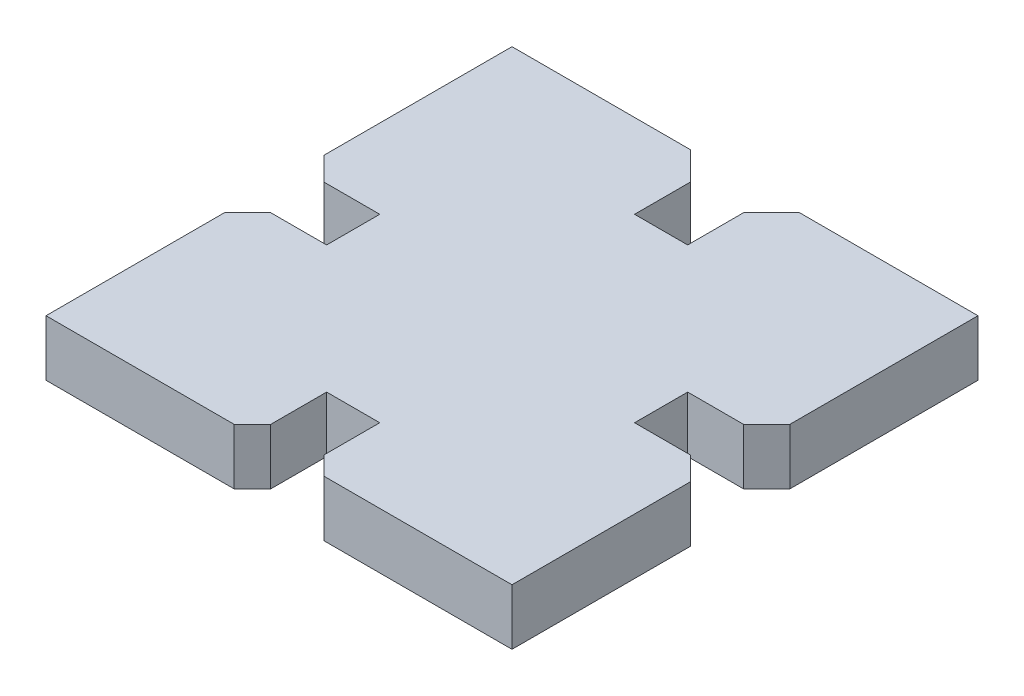
ISO-10303-21;
HEADER;
FILE_DESCRIPTION(('STEP AP214'),'2;1');
FILE_NAME('part.step','',(''),(''),'','','');
FILE_SCHEMA(('AUTOMOTIVE_DESIGN { 1 0 10303 214 1 1 1 1 }'));
ENDSEC;
DATA;
#1=APPLICATION_CONTEXT('core data for automotive mechanical design processes');
#2=APPLICATION_PROTOCOL_DEFINITION('international standard','automotive_design',2000,#1);
#3=PRODUCT_CONTEXT('',#1,'mechanical');
#4=PRODUCT('Part','Part','',(#3));
#5=PRODUCT_RELATED_PRODUCT_CATEGORY('part','',(#4));
#6=PRODUCT_DEFINITION_FORMATION('','',#4);
#7=PRODUCT_DEFINITION_CONTEXT('part definition',#1,'design');
#8=PRODUCT_DEFINITION('design','',#6,#7);
#9=PRODUCT_DEFINITION_SHAPE('','',#8);
#10=(LENGTH_UNIT() NAMED_UNIT(*) SI_UNIT(.MILLI.,.METRE.));
#11=(NAMED_UNIT(*) PLANE_ANGLE_UNIT() SI_UNIT($,.RADIAN.));
#12=(NAMED_UNIT(*) SI_UNIT($,.STERADIAN.) SOLID_ANGLE_UNIT());
#13=UNCERTAINTY_MEASURE_WITH_UNIT(LENGTH_MEASURE(1.E-05),#10,'distance_accuracy_value','');
#14=(GEOMETRIC_REPRESENTATION_CONTEXT(3) GLOBAL_UNCERTAINTY_ASSIGNED_CONTEXT((#13)) GLOBAL_UNIT_ASSIGNED_CONTEXT((#10,
#11,#12)) REPRESENTATION_CONTEXT('',''));
#15=CARTESIAN_POINT('',(0.,0.,0.));
#16=DIRECTION('',(0.,0.,1.));
#17=DIRECTION('',(1.,0.,0.));
#18=AXIS2_PLACEMENT_3D('',#15,#16,#17);
#19=CARTESIAN_POINT('',(0.,6.,0.));
#20=DIRECTION('',(1.,0.,0.));
#21=DIRECTION('',(0.,0.,-1.));
#22=AXIS2_PLACEMENT_3D('',#19,#20,#21);
#23=PLANE('',#22);
#24=DIRECTION('',(0.,-1.,0.));
#25=VECTOR('',#24,1.);
#26=CARTESIAN_POINT('',(0.,6.,-19.1499999999999));
#27=LINE('',#26,#25);
#28=CARTESIAN_POINT('',(0.,0.,-19.1499999999999));
#29=VERTEX_POINT('',#28);
#30=CARTESIAN_POINT('',(0.,6.,-19.1499999999999));
#31=VERTEX_POINT('',#30);
#32=EDGE_CURVE('E343',#29,#31,#27,.F.);
#33=ORIENTED_EDGE('',*,*,#32,.F.);
#34=DIRECTION('',(0.,0.,1.));
#35=VECTOR('',#34,1.);
#36=CARTESIAN_POINT('',(0.,0.,0.));
#37=LINE('',#36,#35);
#38=CARTESIAN_POINT('',(0.,0.,0.));
#39=VERTEX_POINT('',#38);
#40=EDGE_CURVE('E364',#29,#39,#37,.T.);
#41=ORIENTED_EDGE('',*,*,#40,.T.);
#42=DIRECTION('',(0.,-1.,0.));
#43=VECTOR('',#42,1.);
#44=CARTESIAN_POINT('',(0.,6.,0.));
#45=LINE('',#44,#43);
#46=CARTESIAN_POINT('',(0.,6.,0.));
#47=VERTEX_POINT('',#46);
#48=EDGE_CURVE('E406',#47,#39,#45,.T.);
#49=ORIENTED_EDGE('',*,*,#48,.F.);
#50=DIRECTION('',(0.,0.,1.));
#51=VECTOR('',#50,1.);
#52=CARTESIAN_POINT('',(0.,6.,0.));
#53=LINE('',#52,#51);
#54=EDGE_CURVE('E371',#31,#47,#53,.T.);
#55=ORIENTED_EDGE('',*,*,#54,.F.);
#56=EDGE_LOOP('',(#33,#41,#49,#55));
#57=FACE_BOUND('',#56,.T.);
#58=ADVANCED_FACE('F35',(#57),#23,.F.);
#59=DIRECTION('',(0.,1.,0.));
#60=VECTOR('',#59,1.);
#61=CARTESIAN_POINT('',(0.,6.,-29.8108148542853));
#62=LINE('',#61,#60);
#63=CARTESIAN_POINT('',(0.,6.,-29.8108148542853));
#64=VERTEX_POINT('',#63);
#65=CARTESIAN_POINT('',(0.,0.,-29.8108148542853));
#66=VERTEX_POINT('',#65);
#67=EDGE_CURVE('E51',#64,#66,#62,.F.);
#68=ORIENTED_EDGE('',*,*,#67,.F.);
#69=CARTESIAN_POINT('',(0.,6.,-50.));
#70=VERTEX_POINT('',#69);
#71=EDGE_CURVE('E367',#70,#64,#53,.T.);
#72=ORIENTED_EDGE('',*,*,#71,.F.);
#73=DIRECTION('',(0.,-1.,0.));
#74=VECTOR('',#73,1.);
#75=CARTESIAN_POINT('',(0.,6.,-50.));
#76=LINE('',#75,#74);
#77=CARTESIAN_POINT('',(0.,0.,-50.));
#78=VERTEX_POINT('',#77);
#79=EDGE_CURVE('E383',#70,#78,#76,.T.);
#80=ORIENTED_EDGE('',*,*,#79,.T.);
#81=EDGE_CURVE('E384',#78,#66,#37,.T.);
#82=ORIENTED_EDGE('',*,*,#81,.T.);
#83=EDGE_LOOP('',(#68,#72,#80,#82));
#84=FACE_BOUND('',#83,.T.);
#85=ADVANCED_FACE('F477',(#84),#23,.F.);
#86=CARTESIAN_POINT('',(0.,6.,0.));
#87=DIRECTION('',(0.,0.,-1.));
#88=DIRECTION('',(-1.,0.,0.));
#89=AXIS2_PLACEMENT_3D('',#86,#87,#88);
#90=PLANE('',#89);
#91=DIRECTION('',(0.,-1.,0.));
#92=VECTOR('',#91,1.);
#93=CARTESIAN_POINT('',(29.8108148542854,6.,0.));
#94=LINE('',#93,#92);
#95=CARTESIAN_POINT('',(29.8108148542854,0.,0.));
#96=VERTEX_POINT('',#95);
#97=CARTESIAN_POINT('',(29.8108148542854,6.,0.));
#98=VERTEX_POINT('',#97);
#99=EDGE_CURVE('E340',#96,#98,#94,.F.);
#100=ORIENTED_EDGE('',*,*,#99,.F.);
#101=DIRECTION('',(1.,0.,0.));
#102=VECTOR('',#101,1.);
#103=CARTESIAN_POINT('',(0.,0.,0.));
#104=LINE('',#103,#102);
#105=CARTESIAN_POINT('',(50.,0.,0.));
#106=VERTEX_POINT('',#105);
#107=EDGE_CURVE('E386',#96,#106,#104,.T.);
#108=ORIENTED_EDGE('',*,*,#107,.T.);
#109=DIRECTION('',(0.,-1.,0.));
#110=VECTOR('',#109,1.);
#111=CARTESIAN_POINT('',(50.,6.,0.));
#112=LINE('',#111,#110);
#113=CARTESIAN_POINT('',(50.,6.,0.));
#114=VERTEX_POINT('',#113);
#115=EDGE_CURVE('E403',#114,#106,#112,.T.);
#116=ORIENTED_EDGE('',*,*,#115,.F.);
#117=DIRECTION('',(1.,0.,0.));
#118=VECTOR('',#117,1.);
#119=CARTESIAN_POINT('',(0.,6.,0.));
#120=LINE('',#119,#118);
#121=EDGE_CURVE('E370',#98,#114,#120,.T.);
#122=ORIENTED_EDGE('',*,*,#121,.F.);
#123=EDGE_LOOP('',(#100,#108,#116,#122));
#124=FACE_BOUND('',#123,.T.);
#125=ADVANCED_FACE('F439',(#124),#90,.F.);
#126=DIRECTION('',(0.,1.,0.));
#127=VECTOR('',#126,1.);
#128=CARTESIAN_POINT('',(20.1891851457146,6.,0.));
#129=LINE('',#128,#127);
#130=CARTESIAN_POINT('',(20.1891851457146,6.,0.));
#131=VERTEX_POINT('',#130);
#132=CARTESIAN_POINT('',(20.1891851457146,0.,0.));
#133=VERTEX_POINT('',#132);
#134=EDGE_CURVE('E59',#131,#133,#129,.F.);
#135=ORIENTED_EDGE('',*,*,#134,.F.);
#136=EDGE_CURVE('E372',#47,#131,#120,.T.);
#137=ORIENTED_EDGE('',*,*,#136,.F.);
#138=ORIENTED_EDGE('',*,*,#48,.T.);
#139=EDGE_CURVE('E387',#39,#133,#104,.T.);
#140=ORIENTED_EDGE('',*,*,#139,.T.);
#141=EDGE_LOOP('',(#135,#137,#138,#140));
#142=FACE_BOUND('',#141,.T.);
#143=ADVANCED_FACE('F459',(#142),#90,.F.);
#144=CARTESIAN_POINT('',(50.,6.,0.));
#145=DIRECTION('',(-1.,0.,0.));
#146=DIRECTION('',(0.,0.,1.));
#147=AXIS2_PLACEMENT_3D('',#144,#145,#146);
#148=PLANE('',#147);
#149=DIRECTION('',(0.,-1.,0.));
#150=VECTOR('',#149,1.);
#151=CARTESIAN_POINT('',(50.,6.,-29.8108148542857));
#152=LINE('',#151,#150);
#153=CARTESIAN_POINT('',(50.,0.,-29.8108148542857));
#154=VERTEX_POINT('',#153);
#155=CARTESIAN_POINT('',(50.,6.,-29.8108148542857));
#156=VERTEX_POINT('',#155);
#157=EDGE_CURVE('E337',#154,#156,#152,.F.);
#158=ORIENTED_EDGE('',*,*,#157,.F.);
#159=DIRECTION('',(0.,0.,-1.));
#160=VECTOR('',#159,1.);
#161=CARTESIAN_POINT('',(50.,0.,0.));
#162=LINE('',#161,#160);
#163=CARTESIAN_POINT('',(50.,0.,-50.));
#164=VERTEX_POINT('',#163);
#165=EDGE_CURVE('E390',#154,#164,#162,.T.);
#166=ORIENTED_EDGE('',*,*,#165,.T.);
#167=DIRECTION('',(0.,-1.,0.));
#168=VECTOR('',#167,1.);
#169=CARTESIAN_POINT('',(50.,6.,-50.));
#170=LINE('',#169,#168);
#171=CARTESIAN_POINT('',(50.,6.,-50.));
#172=VERTEX_POINT('',#171);
#173=EDGE_CURVE('E400',#172,#164,#170,.T.);
#174=ORIENTED_EDGE('',*,*,#173,.F.);
#175=DIRECTION('',(0.,0.,-1.));
#176=VECTOR('',#175,1.);
#177=CARTESIAN_POINT('',(50.,6.,0.));
#178=LINE('',#177,#176);
#179=EDGE_CURVE('E375',#156,#172,#178,.T.);
#180=ORIENTED_EDGE('',*,*,#179,.F.);
#181=EDGE_LOOP('',(#158,#166,#174,#180));
#182=FACE_BOUND('',#181,.T.);
#183=ADVANCED_FACE('F513',(#182),#148,.F.);
#184=DIRECTION('',(0.,1.,0.));
#185=VECTOR('',#184,1.);
#186=CARTESIAN_POINT('',(50.,6.,-19.1500000000003));
#187=LINE('',#186,#185);
#188=CARTESIAN_POINT('',(50.,6.,-19.1500000000003));
#189=VERTEX_POINT('',#188);
#190=CARTESIAN_POINT('',(50.,0.,-19.1500000000003));
#191=VERTEX_POINT('',#190);
#192=EDGE_CURVE('E265',#189,#191,#187,.F.);
#193=ORIENTED_EDGE('',*,*,#192,.F.);
#194=EDGE_CURVE('E376',#114,#189,#178,.T.);
#195=ORIENTED_EDGE('',*,*,#194,.F.);
#196=ORIENTED_EDGE('',*,*,#115,.T.);
#197=EDGE_CURVE('E391',#106,#191,#162,.T.);
#198=ORIENTED_EDGE('',*,*,#197,.T.);
#199=EDGE_LOOP('',(#193,#195,#196,#198));
#200=FACE_BOUND('',#199,.T.);
#201=ADVANCED_FACE('F532',(#200),#148,.F.);
#202=CARTESIAN_POINT('',(0.,6.,0.));
#203=DIRECTION('',(0.,-1.,0.));
#204=DIRECTION('',(0.,0.,-1.));
#205=AXIS2_PLACEMENT_3D('',#202,#203,#204);
#206=PLANE('',#205);
#207=DIRECTION('',(0.707106781186542,0.,-0.707106781186553));
#208=VECTOR('',#207,1.);
#209=CARTESIAN_POINT('',(2.48040742714267,6.,-21.6304074271426));
#210=LINE('',#209,#208);
#211=CARTESIAN_POINT('',(2.48040742714267,6.,-21.6304074271426));
#212=VERTEX_POINT('',#211);
#213=EDGE_CURVE('E262',#212,#31,#210,.F.);
#214=ORIENTED_EDGE('',*,*,#213,.T.);
#215=ORIENTED_EDGE('',*,*,#54,.T.);
#216=ORIENTED_EDGE('',*,*,#136,.T.);
#217=DIRECTION('',(-0.707106781186547,0.,0.707106781186548));
#218=VECTOR('',#217,1.);
#219=CARTESIAN_POINT('',(19.15,6.,1.03918514571464));
#220=LINE('',#219,#218);
#221=CARTESIAN_POINT('',(22.15,6.,-1.96081485428538));
#222=VERTEX_POINT('',#221);
#223=EDGE_CURVE('E272',#131,#222,#220,.F.);
#224=ORIENTED_EDGE('',*,*,#223,.T.);
#225=DIRECTION('',(0.,0.,1.));
#226=VECTOR('',#225,1.);
#227=CARTESIAN_POINT('',(22.15,6.,1.03918514571464));
#228=LINE('',#227,#226);
#229=CARTESIAN_POINT('',(22.15,6.,-7.96081485428536));
#230=VERTEX_POINT('',#229);
#231=EDGE_CURVE('E275',#230,#222,#228,.T.);
#232=ORIENTED_EDGE('',*,*,#231,.F.);
#233=DIRECTION('',(-1.,0.,0.));
#234=VECTOR('',#233,1.);
#235=CARTESIAN_POINT('',(27.85,6.,-7.96081485428536));
#236=LINE('',#235,#234);
#237=CARTESIAN_POINT('',(27.85,6.,-7.96081485428536));
#238=VERTEX_POINT('',#237);
#239=EDGE_CURVE('E283',#238,#230,#236,.T.);
#240=ORIENTED_EDGE('',*,*,#239,.F.);
#241=DIRECTION('',(0.,0.,-1.));
#242=VECTOR('',#241,1.);
#243=CARTESIAN_POINT('',(27.85,6.,1.03918514571464));
#244=LINE('',#243,#242);
#245=CARTESIAN_POINT('',(27.85,6.,-1.96081485428534));
#246=VERTEX_POINT('',#245);
#247=EDGE_CURVE('E296',#246,#238,#244,.T.);
#248=ORIENTED_EDGE('',*,*,#247,.F.);
#249=DIRECTION('',(-0.707106781186551,0.,-0.707106781186544));
#250=VECTOR('',#249,1.);
#251=CARTESIAN_POINT('',(27.85,6.,-1.96081485428534));
#252=LINE('',#251,#250);
#253=EDGE_CURVE('E227',#246,#98,#252,.F.);
#254=ORIENTED_EDGE('',*,*,#253,.T.);
#255=ORIENTED_EDGE('',*,*,#121,.T.);
#256=ORIENTED_EDGE('',*,*,#194,.T.);
#257=DIRECTION('',(0.707106781186556,0.,0.707106781186539));
#258=VECTOR('',#257,1.);
#259=CARTESIAN_POINT('',(50.5195925728574,6.,-18.6304074271429));
#260=LINE('',#259,#258);
#261=CARTESIAN_POINT('',(47.5195925728573,6.,-21.6304074271429));
#262=VERTEX_POINT('',#261);
#263=EDGE_CURVE('E307',#189,#262,#260,.F.);
#264=ORIENTED_EDGE('',*,*,#263,.T.);
#265=DIRECTION('',(1.,0.,0.));
#266=VECTOR('',#265,1.);
#267=CARTESIAN_POINT('',(50.5195925728574,6.,-21.630407427143));
#268=LINE('',#267,#266);
#269=CARTESIAN_POINT('',(41.5195925728574,6.,-21.6304074271429));
#270=VERTEX_POINT('',#269);
#271=EDGE_CURVE('E310',#270,#262,#268,.T.);
#272=ORIENTED_EDGE('',*,*,#271,.F.);
#273=DIRECTION('',(0.,0.,1.));
#274=VECTOR('',#273,1.);
#275=CARTESIAN_POINT('',(41.5195925728573,6.,-27.3304074271429));
#276=LINE('',#275,#274);
#277=CARTESIAN_POINT('',(41.5195925728573,6.,-27.3304074271429));
#278=VERTEX_POINT('',#277);
#279=EDGE_CURVE('E318',#278,#270,#276,.T.);
#280=ORIENTED_EDGE('',*,*,#279,.F.);
#281=DIRECTION('',(-1.,0.,0.));
#282=VECTOR('',#281,1.);
#283=CARTESIAN_POINT('',(50.5195925728573,6.,-27.330407427143));
#284=LINE('',#283,#282);
#285=CARTESIAN_POINT('',(47.5195925728573,6.,-27.3304074271429));
#286=VERTEX_POINT('',#285);
#287=EDGE_CURVE('E331',#286,#278,#284,.T.);
#288=ORIENTED_EDGE('',*,*,#287,.F.);
#289=DIRECTION('',(-0.707106781186537,0.,0.707106781186558));
#290=VECTOR('',#289,1.);
#291=CARTESIAN_POINT('',(47.5195925728573,6.,-27.3304074271429));
#292=LINE('',#291,#290);
#293=EDGE_CURVE('E269',#286,#156,#292,.F.);
#294=ORIENTED_EDGE('',*,*,#293,.T.);
#295=ORIENTED_EDGE('',*,*,#179,.T.);
#296=DIRECTION('',(-1.,0.,0.));
#297=VECTOR('',#296,1.);
#298=CARTESIAN_POINT('',(0.,6.,-50.));
#299=LINE('',#298,#297);
#300=CARTESIAN_POINT('',(30.85,6.,-50.));
#301=VERTEX_POINT('',#300);
#302=EDGE_CURVE('E380',#172,#301,#299,.T.);
#303=ORIENTED_EDGE('',*,*,#302,.T.);
#304=DIRECTION('',(0.707106781186547,0.,-0.707106781186548));
#305=VECTOR('',#304,1.);
#306=CARTESIAN_POINT('',(30.85,6.,-50.));
#307=LINE('',#306,#305);
#308=CARTESIAN_POINT('',(27.85,6.,-47.));
#309=VERTEX_POINT('',#308);
#310=EDGE_CURVE('E412',#301,#309,#307,.F.);
#311=ORIENTED_EDGE('',*,*,#310,.T.);
#312=DIRECTION('',(0.,0.,-1.));
#313=VECTOR('',#312,1.);
#314=CARTESIAN_POINT('',(27.85,6.,-50.));
#315=LINE('',#314,#313);
#316=CARTESIAN_POINT('',(27.85,6.,-41.));
#317=VERTEX_POINT('',#316);
#318=EDGE_CURVE('E349',#317,#309,#315,.T.);
#319=ORIENTED_EDGE('',*,*,#318,.F.);
#320=DIRECTION('',(1.,0.,0.));
#321=VECTOR('',#320,1.);
#322=CARTESIAN_POINT('',(22.15,6.,-41.));
#323=LINE('',#322,#321);
#324=CARTESIAN_POINT('',(22.15,6.,-41.));
#325=VERTEX_POINT('',#324);
#326=EDGE_CURVE('E357',#325,#317,#323,.T.);
#327=ORIENTED_EDGE('',*,*,#326,.F.);
#328=DIRECTION('',(0.,0.,1.));
#329=VECTOR('',#328,1.);
#330=CARTESIAN_POINT('',(22.15,6.,-50.));
#331=LINE('',#330,#329);
#332=CARTESIAN_POINT('',(22.15,6.,-47.));
#333=VERTEX_POINT('',#332);
#334=EDGE_CURVE('E345',#333,#325,#331,.T.);
#335=ORIENTED_EDGE('',*,*,#334,.F.);
#336=DIRECTION('',(0.707106781186551,0.,0.707106781186544));
#337=VECTOR('',#336,1.);
#338=CARTESIAN_POINT('',(22.15,6.,-47.));
#339=LINE('',#338,#337);
#340=CARTESIAN_POINT('',(19.15,6.,-50.));
#341=VERTEX_POINT('',#340);
#342=EDGE_CURVE('E414',#333,#341,#339,.F.);
#343=ORIENTED_EDGE('',*,*,#342,.T.);
#344=EDGE_CURVE('E379',#341,#70,#299,.T.);
#345=ORIENTED_EDGE('',*,*,#344,.T.);
#346=ORIENTED_EDGE('',*,*,#71,.T.);
#347=DIRECTION('',(-0.707106781186551,0.,-0.707106781186544));
#348=VECTOR('',#347,1.);
#349=CARTESIAN_POINT('',(-0.519592572857344,6.,-30.3304074271426));
#350=LINE('',#349,#348);
#351=CARTESIAN_POINT('',(2.48040742714269,6.,-27.3304074271426));
#352=VERTEX_POINT('',#351);
#353=EDGE_CURVE('E236',#64,#352,#350,.F.);
#354=ORIENTED_EDGE('',*,*,#353,.T.);
#355=DIRECTION('',(-1.,0.,0.));
#356=VECTOR('',#355,1.);
#357=CARTESIAN_POINT('',(-0.51959257285733,6.,-27.3304074271426));
#358=LINE('',#357,#356);
#359=CARTESIAN_POINT('',(8.48040742714267,6.,-27.3304074271426));
#360=VERTEX_POINT('',#359);
#361=EDGE_CURVE('E234',#360,#352,#358,.T.);
#362=ORIENTED_EDGE('',*,*,#361,.F.);
#363=DIRECTION('',(0.,0.,-1.));
#364=VECTOR('',#363,1.);
#365=CARTESIAN_POINT('',(8.48040742714269,6.,-21.6304074271426));
#366=LINE('',#365,#364);
#367=CARTESIAN_POINT('',(8.48040742714269,6.,-21.6304074271426));
#368=VERTEX_POINT('',#367);
#369=EDGE_CURVE('E245',#368,#360,#366,.T.);
#370=ORIENTED_EDGE('',*,*,#369,.F.);
#371=DIRECTION('',(1.,0.,0.));
#372=VECTOR('',#371,1.);
#373=CARTESIAN_POINT('',(-0.519592572857309,6.,-21.6304074271426));
#374=LINE('',#373,#372);
#375=EDGE_CURVE('E259',#212,#368,#374,.T.);
#376=ORIENTED_EDGE('',*,*,#375,.F.);
#377=EDGE_LOOP('',(#214,#215,#216,#224,#232,#240,#248,#254,#255,#256,#264,#272,#280,#288,#294,
#295,#303,#311,#319,#327,#335,#343,#345,#346,#354,#362,#370,#376));
#378=FACE_BOUND('',#377,.T.);
#379=ADVANCED_FACE('F443',(#378),#206,.F.);
#380=CARTESIAN_POINT('',(0.,0.,0.));
#381=DIRECTION('',(0.,-1.,0.));
#382=DIRECTION('',(0.,0.,-1.));
#383=AXIS2_PLACEMENT_3D('',#380,#381,#382);
#384=PLANE('',#383);
#385=ORIENTED_EDGE('',*,*,#40,.F.);
#386=DIRECTION('',(-0.707106781186542,0.,0.707106781186553));
#387=VECTOR('',#386,1.);
#388=CARTESIAN_POINT('',(-9.57499999999994,0.,-9.57499999999979));
#389=LINE('',#388,#387);
#390=CARTESIAN_POINT('',(2.48040742714267,0.,-21.6304074271426));
#391=VERTEX_POINT('',#390);
#392=EDGE_CURVE('E11',#29,#391,#389,.F.);
#393=ORIENTED_EDGE('',*,*,#392,.T.);
#394=DIRECTION('',(1.,0.,0.));
#395=VECTOR('',#394,1.);
#396=CARTESIAN_POINT('',(-0.519592572857309,0.,-21.6304074271426));
#397=LINE('',#396,#395);
#398=CARTESIAN_POINT('',(8.48040742714269,0.,-21.6304074271426));
#399=VERTEX_POINT('',#398);
#400=EDGE_CURVE('E255',#391,#399,#397,.T.);
#401=ORIENTED_EDGE('',*,*,#400,.T.);
#402=DIRECTION('',(0.,0.,-1.));
#403=VECTOR('',#402,1.);
#404=CARTESIAN_POINT('',(8.48040742714269,0.,-21.6304074271426));
#405=LINE('',#404,#403);
#406=CARTESIAN_POINT('',(8.48040742714267,0.,-27.3304074271426));
#407=VERTEX_POINT('',#406);
#408=EDGE_CURVE('E242',#399,#407,#405,.T.);
#409=ORIENTED_EDGE('',*,*,#408,.T.);
#410=DIRECTION('',(-1.,0.,0.));
#411=VECTOR('',#410,1.);
#412=CARTESIAN_POINT('',(-0.51959257285733,0.,-27.3304074271426));
#413=LINE('',#412,#411);
#414=CARTESIAN_POINT('',(2.48040742714269,0.,-27.3304074271426));
#415=VERTEX_POINT('',#414);
#416=EDGE_CURVE('E231',#407,#415,#413,.T.);
#417=ORIENTED_EDGE('',*,*,#416,.T.);
#418=DIRECTION('',(0.707106781186551,0.,0.707106781186544));
#419=VECTOR('',#418,1.);
#420=CARTESIAN_POINT('',(39.9054074271429,0.,10.0945925728572));
#421=LINE('',#420,#419);
#422=EDGE_CURVE('E218',#415,#66,#421,.F.);
#423=ORIENTED_EDGE('',*,*,#422,.T.);
#424=ORIENTED_EDGE('',*,*,#81,.F.);
#425=DIRECTION('',(-1.,0.,0.));
#426=VECTOR('',#425,1.);
#427=CARTESIAN_POINT('',(0.,0.,-50.));
#428=LINE('',#427,#426);
#429=CARTESIAN_POINT('',(19.15,0.,-50.));
#430=VERTEX_POINT('',#429);
#431=EDGE_CURVE('E394',#430,#78,#428,.T.);
#432=ORIENTED_EDGE('',*,*,#431,.F.);
#433=DIRECTION('',(-0.707106781186551,0.,-0.707106781186544));
#434=VECTOR('',#433,1.);
#435=CARTESIAN_POINT('',(34.5749999999999,0.,-34.5750000000002));
#436=LINE('',#435,#434);
#437=CARTESIAN_POINT('',(22.15,0.,-47.));
#438=VERTEX_POINT('',#437);
#439=EDGE_CURVE('E420',#430,#438,#436,.F.);
#440=ORIENTED_EDGE('',*,*,#439,.T.);
#441=DIRECTION('',(0.,0.,1.));
#442=VECTOR('',#441,1.);
#443=CARTESIAN_POINT('',(22.15,0.,-50.));
#444=LINE('',#443,#442);
#445=CARTESIAN_POINT('',(22.15,0.,-41.));
#446=VERTEX_POINT('',#445);
#447=EDGE_CURVE('E346',#438,#446,#444,.T.);
#448=ORIENTED_EDGE('',*,*,#447,.T.);
#449=DIRECTION('',(1.,0.,0.));
#450=VECTOR('',#449,1.);
#451=CARTESIAN_POINT('',(22.15,0.,-41.));
#452=LINE('',#451,#450);
#453=CARTESIAN_POINT('',(27.85,0.,-41.));
#454=VERTEX_POINT('',#453);
#455=EDGE_CURVE('E348',#446,#454,#452,.T.);
#456=ORIENTED_EDGE('',*,*,#455,.T.);
#457=DIRECTION('',(0.,0.,-1.));
#458=VECTOR('',#457,1.);
#459=CARTESIAN_POINT('',(27.85,0.,-50.));
#460=LINE('',#459,#458);
#461=CARTESIAN_POINT('',(27.85,0.,-47.));
#462=VERTEX_POINT('',#461);
#463=EDGE_CURVE('E352',#454,#462,#460,.T.);
#464=ORIENTED_EDGE('',*,*,#463,.T.);
#465=DIRECTION('',(-0.707106781186547,0.,0.707106781186548));
#466=VECTOR('',#465,1.);
#467=CARTESIAN_POINT('',(-9.57499999999996,0.,-9.57499999999994));
#468=LINE('',#467,#466);
#469=CARTESIAN_POINT('',(30.85,0.,-50.));
#470=VERTEX_POINT('',#469);
#471=EDGE_CURVE('E418',#462,#470,#468,.F.);
#472=ORIENTED_EDGE('',*,*,#471,.T.);
#473=EDGE_CURVE('E395',#164,#470,#428,.T.);
#474=ORIENTED_EDGE('',*,*,#473,.F.);
#475=ORIENTED_EDGE('',*,*,#165,.F.);
#476=DIRECTION('',(0.707106781186537,0.,-0.707106781186558));
#477=VECTOR('',#476,1.);
#478=CARTESIAN_POINT('',(10.0945925728579,0.,10.0945925728576));
#479=LINE('',#478,#477);
#480=CARTESIAN_POINT('',(47.5195925728573,0.,-27.3304074271429));
#481=VERTEX_POINT('',#480);
#482=EDGE_CURVE('E427',#154,#481,#479,.F.);
#483=ORIENTED_EDGE('',*,*,#482,.T.);
#484=DIRECTION('',(-1.,0.,0.));
#485=VECTOR('',#484,1.);
#486=CARTESIAN_POINT('',(50.5195925728573,0.,-27.330407427143));
#487=LINE('',#486,#485);
#488=CARTESIAN_POINT('',(41.5195925728573,0.,-27.3304074271429));
#489=VERTEX_POINT('',#488);
#490=EDGE_CURVE('E326',#481,#489,#487,.T.);
#491=ORIENTED_EDGE('',*,*,#490,.T.);
#492=DIRECTION('',(0.,0.,1.));
#493=VECTOR('',#492,1.);
#494=CARTESIAN_POINT('',(41.5195925728573,0.,-27.3304074271429));
#495=LINE('',#494,#493);
#496=CARTESIAN_POINT('',(41.5195925728574,0.,-21.6304074271429));
#497=VERTEX_POINT('',#496);
#498=EDGE_CURVE('E321',#489,#497,#495,.T.);
#499=ORIENTED_EDGE('',*,*,#498,.T.);
#500=DIRECTION('',(1.,0.,0.));
#501=VECTOR('',#500,1.);
#502=CARTESIAN_POINT('',(50.5195925728574,0.,-21.630407427143));
#503=LINE('',#502,#501);
#504=CARTESIAN_POINT('',(47.5195925728573,0.,-21.6304074271429));
#505=VERTEX_POINT('',#504);
#506=EDGE_CURVE('E313',#497,#505,#503,.T.);
#507=ORIENTED_EDGE('',*,*,#506,.T.);
#508=DIRECTION('',(-0.707106781186556,0.,-0.707106781186539));
#509=VECTOR('',#508,1.);
#510=CARTESIAN_POINT('',(10.0945925728569,0.,-59.0554074271425));
#511=LINE('',#510,#509);
#512=EDGE_CURVE('E301',#505,#191,#511,.F.);
#513=ORIENTED_EDGE('',*,*,#512,.T.);
#514=ORIENTED_EDGE('',*,*,#197,.F.);
#515=ORIENTED_EDGE('',*,*,#107,.F.);
#516=DIRECTION('',(0.707106781186551,0.,0.707106781186544));
#517=VECTOR('',#516,1.);
#518=CARTESIAN_POINT('',(14.9054074271425,0.,-14.9054074271427));
#519=LINE('',#518,#517);
#520=CARTESIAN_POINT('',(27.85,0.,-1.96081485428534));
#521=VERTEX_POINT('',#520);
#522=EDGE_CURVE('E44',#96,#521,#519,.F.);
#523=ORIENTED_EDGE('',*,*,#522,.T.);
#524=DIRECTION('',(0.,0.,-1.));
#525=VECTOR('',#524,1.);
#526=CARTESIAN_POINT('',(27.85,0.,1.03918514571464));
#527=LINE('',#526,#525);
#528=CARTESIAN_POINT('',(27.85,0.,-7.96081485428536));
#529=VERTEX_POINT('',#528);
#530=EDGE_CURVE('E291',#521,#529,#527,.T.);
#531=ORIENTED_EDGE('',*,*,#530,.T.);
#532=DIRECTION('',(-1.,0.,0.));
#533=VECTOR('',#532,1.);
#534=CARTESIAN_POINT('',(27.85,0.,-7.96081485428536));
#535=LINE('',#534,#533);
#536=CARTESIAN_POINT('',(22.15,0.,-7.96081485428536));
#537=VERTEX_POINT('',#536);
#538=EDGE_CURVE('E286',#529,#537,#535,.T.);
#539=ORIENTED_EDGE('',*,*,#538,.T.);
#540=DIRECTION('',(0.,0.,1.));
#541=VECTOR('',#540,1.);
#542=CARTESIAN_POINT('',(22.15,0.,1.03918514571464));
#543=LINE('',#542,#541);
#544=CARTESIAN_POINT('',(22.15,0.,-1.96081485428538));
#545=VERTEX_POINT('',#544);
#546=EDGE_CURVE('E278',#537,#545,#543,.T.);
#547=ORIENTED_EDGE('',*,*,#546,.T.);
#548=DIRECTION('',(0.707106781186547,0.,-0.707106781186548));
#549=VECTOR('',#548,1.);
#550=CARTESIAN_POINT('',(59.575,0.,-39.3858148542854));
#551=LINE('',#550,#549);
#552=EDGE_CURVE('E266',#545,#133,#551,.F.);
#553=ORIENTED_EDGE('',*,*,#552,.T.);
#554=ORIENTED_EDGE('',*,*,#139,.F.);
#555=EDGE_LOOP('',(#385,#393,#401,#409,#417,#423,#424,#432,#440,#448,#456,#464,#472,#474,#475,
#483,#491,#499,#507,#513,#514,#515,#523,#531,#539,#547,#553,#554));
#556=FACE_BOUND('',#555,.T.);
#557=ADVANCED_FACE('F240',(#556),#384,.T.);
#558=CARTESIAN_POINT('',(0.,6.,-50.));
#559=DIRECTION('',(0.,0.,1.));
#560=DIRECTION('',(1.,0.,0.));
#561=AXIS2_PLACEMENT_3D('',#558,#559,#560);
#562=PLANE('',#561);
#563=ORIENTED_EDGE('',*,*,#344,.F.);
#564=DIRECTION('',(0.,-1.,0.));
#565=VECTOR('',#564,1.);
#566=CARTESIAN_POINT('',(19.15,6.,-50.));
#567=LINE('',#566,#565);
#568=EDGE_CURVE('E416',#341,#430,#567,.T.);
#569=ORIENTED_EDGE('',*,*,#568,.T.);
#570=ORIENTED_EDGE('',*,*,#431,.T.);
#571=ORIENTED_EDGE('',*,*,#79,.F.);
#572=EDGE_LOOP('',(#563,#569,#570,#571));
#573=FACE_BOUND('',#572,.T.);
#574=ADVANCED_FACE('F566',(#573),#562,.F.);
#575=ORIENTED_EDGE('',*,*,#473,.T.);
#576=DIRECTION('',(0.,1.,0.));
#577=VECTOR('',#576,1.);
#578=CARTESIAN_POINT('',(30.85,6.,-50.));
#579=LINE('',#578,#577);
#580=EDGE_CURVE('E422',#470,#301,#579,.T.);
#581=ORIENTED_EDGE('',*,*,#580,.T.);
#582=ORIENTED_EDGE('',*,*,#302,.F.);
#583=ORIENTED_EDGE('',*,*,#173,.T.);
#584=EDGE_LOOP('',(#575,#581,#582,#583));
#585=FACE_BOUND('',#584,.T.);
#586=ADVANCED_FACE('F506',(#585),#562,.F.);
#587=CARTESIAN_POINT('',(22.15,0.,-50.));
#588=DIRECTION('',(-1.,0.,0.));
#589=DIRECTION('',(0.,0.,1.));
#590=AXIS2_PLACEMENT_3D('',#587,#588,#589);
#591=PLANE('',#590);
#592=ORIENTED_EDGE('',*,*,#447,.F.);
#593=DIRECTION('',(0.,1.,0.));
#594=VECTOR('',#593,1.);
#595=CARTESIAN_POINT('',(22.15,0.,-47.));
#596=LINE('',#595,#594);
#597=EDGE_CURVE('E409',#438,#333,#596,.T.);
#598=ORIENTED_EDGE('',*,*,#597,.T.);
#599=ORIENTED_EDGE('',*,*,#334,.T.);
#600=DIRECTION('',(0.,1.,0.));
#601=VECTOR('',#600,1.);
#602=CARTESIAN_POINT('',(22.15,0.,-41.));
#603=LINE('',#602,#601);
#604=EDGE_CURVE('E355',#446,#325,#603,.T.);
#605=ORIENTED_EDGE('',*,*,#604,.F.);
#606=EDGE_LOOP('',(#592,#598,#599,#605));
#607=FACE_BOUND('',#606,.T.);
#608=ADVANCED_FACE('F489',(#607),#591,.F.);
#609=CARTESIAN_POINT('',(27.85,0.,-50.));
#610=DIRECTION('',(1.,0.,0.));
#611=DIRECTION('',(0.,0.,-1.));
#612=AXIS2_PLACEMENT_3D('',#609,#610,#611);
#613=PLANE('',#612);
#614=ORIENTED_EDGE('',*,*,#318,.T.);
#615=DIRECTION('',(0.,-1.,0.));
#616=VECTOR('',#615,1.);
#617=CARTESIAN_POINT('',(27.85,0.,-47.));
#618=LINE('',#617,#616);
#619=EDGE_CURVE('E425',#309,#462,#618,.T.);
#620=ORIENTED_EDGE('',*,*,#619,.T.);
#621=ORIENTED_EDGE('',*,*,#463,.F.);
#622=DIRECTION('',(0.,1.,0.));
#623=VECTOR('',#622,1.);
#624=CARTESIAN_POINT('',(27.85,0.,-41.));
#625=LINE('',#624,#623);
#626=EDGE_CURVE('E362',#454,#317,#625,.T.);
#627=ORIENTED_EDGE('',*,*,#626,.T.);
#628=EDGE_LOOP('',(#614,#620,#621,#627));
#629=FACE_BOUND('',#628,.T.);
#630=ADVANCED_FACE('F555',(#629),#613,.F.);
#631=CARTESIAN_POINT('',(22.15,0.,-41.));
#632=DIRECTION('',(0.,0.,1.));
#633=DIRECTION('',(1.,0.,0.));
#634=AXIS2_PLACEMENT_3D('',#631,#632,#633);
#635=PLANE('',#634);
#636=ORIENTED_EDGE('',*,*,#326,.T.);
#637=ORIENTED_EDGE('',*,*,#626,.F.);
#638=ORIENTED_EDGE('',*,*,#455,.F.);
#639=ORIENTED_EDGE('',*,*,#604,.T.);
#640=EDGE_LOOP('',(#636,#637,#638,#639));
#641=FACE_BOUND('',#640,.T.);
#642=ADVANCED_FACE('F496',(#641),#635,.F.);
#643=CARTESIAN_POINT('',(22.15,0.,-47.));
#644=DIRECTION('',(-0.707106781186544,0.,0.707106781186551));
#645=DIRECTION('',(0.,1.,0.));
#646=AXIS2_PLACEMENT_3D('',#643,#644,#645);
#647=PLANE('',#646);
#648=ORIENTED_EDGE('',*,*,#439,.F.);
#649=ORIENTED_EDGE('',*,*,#568,.F.);
#650=ORIENTED_EDGE('',*,*,#342,.F.);
#651=ORIENTED_EDGE('',*,*,#597,.F.);
#652=EDGE_LOOP('',(#648,#649,#650,#651));
#653=FACE_BOUND('',#652,.T.);
#654=ADVANCED_FACE('F486',(#653),#647,.F.);
#655=CARTESIAN_POINT('',(30.85,6.,-50.));
#656=DIRECTION('',(0.707106781186548,0.,0.707106781186547));
#657=DIRECTION('',(0.,1.,0.));
#658=AXIS2_PLACEMENT_3D('',#655,#656,#657);
#659=PLANE('',#658);
#660=ORIENTED_EDGE('',*,*,#471,.F.);
#661=ORIENTED_EDGE('',*,*,#619,.F.);
#662=ORIENTED_EDGE('',*,*,#310,.F.);
#663=ORIENTED_EDGE('',*,*,#580,.F.);
#664=EDGE_LOOP('',(#660,#661,#662,#663));
#665=FACE_BOUND('',#664,.T.);
#666=ADVANCED_FACE('F38',(#665),#659,.F.);
#667=CARTESIAN_POINT('',(47.5195925728573,0.,-27.3304074271429));
#668=DIRECTION('',(-0.707106781186558,0.,-0.707106781186537));
#669=DIRECTION('',(0.,1.,0.));
#670=AXIS2_PLACEMENT_3D('',#667,#668,#669);
#671=PLANE('',#670);
#672=ORIENTED_EDGE('',*,*,#157,.T.);
#673=ORIENTED_EDGE('',*,*,#293,.F.);
#674=DIRECTION('',(0.,1.,0.));
#675=VECTOR('',#674,1.);
#676=CARTESIAN_POINT('',(47.5195925728573,0.,-27.3304074271429));
#677=LINE('',#676,#675);
#678=EDGE_CURVE('E329',#481,#286,#677,.T.);
#679=ORIENTED_EDGE('',*,*,#678,.F.);
#680=ORIENTED_EDGE('',*,*,#482,.F.);
#681=EDGE_LOOP('',(#672,#673,#679,#680));
#682=FACE_BOUND('',#681,.T.);
#683=ADVANCED_FACE('F517',(#682),#671,.F.);
#684=CARTESIAN_POINT('',(50.5195925728574,6.,-18.6304074271429));
#685=DIRECTION('',(-0.707106781186539,0.,0.707106781186556));
#686=DIRECTION('',(0.,1.,0.));
#687=AXIS2_PLACEMENT_3D('',#684,#685,#686);
#688=PLANE('',#687);
#689=ORIENTED_EDGE('',*,*,#192,.T.);
#690=ORIENTED_EDGE('',*,*,#512,.F.);
#691=DIRECTION('',(0.,-1.,0.));
#692=VECTOR('',#691,1.);
#693=CARTESIAN_POINT('',(47.5195925728573,0.,-21.6304074271429));
#694=LINE('',#693,#692);
#695=EDGE_CURVE('E304',#262,#505,#694,.T.);
#696=ORIENTED_EDGE('',*,*,#695,.F.);
#697=ORIENTED_EDGE('',*,*,#263,.F.);
#698=EDGE_LOOP('',(#689,#690,#696,#697));
#699=FACE_BOUND('',#698,.T.);
#700=ADVANCED_FACE('F529',(#699),#688,.F.);
#701=CARTESIAN_POINT('',(50.5195925728573,0.,-27.330407427143));
#702=DIRECTION('',(0.,0.,-1.));
#703=DIRECTION('',(-1.,0.,0.));
#704=AXIS2_PLACEMENT_3D('',#701,#702,#703);
#705=PLANE('',#704);
#706=ORIENTED_EDGE('',*,*,#490,.F.);
#707=ORIENTED_EDGE('',*,*,#678,.T.);
#708=ORIENTED_EDGE('',*,*,#287,.T.);
#709=DIRECTION('',(0.,1.,0.));
#710=VECTOR('',#709,1.);
#711=CARTESIAN_POINT('',(41.5195925728573,0.,-27.3304074271429));
#712=LINE('',#711,#710);
#713=EDGE_CURVE('E324',#489,#278,#712,.T.);
#714=ORIENTED_EDGE('',*,*,#713,.F.);
#715=EDGE_LOOP('',(#706,#707,#708,#714));
#716=FACE_BOUND('',#715,.T.);
#717=ADVANCED_FACE('F519',(#716),#705,.F.);
#718=CARTESIAN_POINT('',(41.5195925728573,0.,-27.3304074271429));
#719=DIRECTION('',(-1.,0.,0.));
#720=DIRECTION('',(0.,0.,1.));
#721=AXIS2_PLACEMENT_3D('',#718,#719,#720);
#722=PLANE('',#721);
#723=ORIENTED_EDGE('',*,*,#279,.T.);
#724=DIRECTION('',(0.,1.,0.));
#725=VECTOR('',#724,1.);
#726=CARTESIAN_POINT('',(41.5195925728574,0.,-21.6304074271429));
#727=LINE('',#726,#725);
#728=EDGE_CURVE('E316',#497,#270,#727,.T.);
#729=ORIENTED_EDGE('',*,*,#728,.F.);
#730=ORIENTED_EDGE('',*,*,#498,.F.);
#731=ORIENTED_EDGE('',*,*,#713,.T.);
#732=EDGE_LOOP('',(#723,#729,#730,#731));
#733=FACE_BOUND('',#732,.T.);
#734=ADVANCED_FACE('F523',(#733),#722,.F.);
#735=CARTESIAN_POINT('',(50.5195925728574,0.,-21.630407427143));
#736=DIRECTION('',(0.,0.,1.));
#737=DIRECTION('',(1.,0.,0.));
#738=AXIS2_PLACEMENT_3D('',#735,#736,#737);
#739=PLANE('',#738);
#740=ORIENTED_EDGE('',*,*,#271,.T.);
#741=ORIENTED_EDGE('',*,*,#695,.T.);
#742=ORIENTED_EDGE('',*,*,#506,.F.);
#743=ORIENTED_EDGE('',*,*,#728,.T.);
#744=EDGE_LOOP('',(#740,#741,#742,#743));
#745=FACE_BOUND('',#744,.T.);
#746=ADVANCED_FACE('F527',(#745),#739,.F.);
#747=CARTESIAN_POINT('',(27.85,0.,-1.96081485428534));
#748=DIRECTION('',(0.707106781186544,0.,-0.707106781186551));
#749=DIRECTION('',(0.,1.,0.));
#750=AXIS2_PLACEMENT_3D('',#747,#748,#749);
#751=PLANE('',#750);
#752=ORIENTED_EDGE('',*,*,#99,.T.);
#753=ORIENTED_EDGE('',*,*,#253,.F.);
#754=DIRECTION('',(0.,1.,0.));
#755=VECTOR('',#754,1.);
#756=CARTESIAN_POINT('',(27.85,0.,-1.96081485428534));
#757=LINE('',#756,#755);
#758=EDGE_CURVE('E294',#521,#246,#757,.T.);
#759=ORIENTED_EDGE('',*,*,#758,.F.);
#760=ORIENTED_EDGE('',*,*,#522,.F.);
#761=EDGE_LOOP('',(#752,#753,#759,#760));
#762=FACE_BOUND('',#761,.T.);
#763=ADVANCED_FACE('F435',(#762),#751,.F.);
#764=CARTESIAN_POINT('',(19.15,6.,1.03918514571464));
#765=DIRECTION('',(-0.707106781186548,0.,-0.707106781186547));
#766=DIRECTION('',(0.,1.,0.));
#767=AXIS2_PLACEMENT_3D('',#764,#765,#766);
#768=PLANE('',#767);
#769=ORIENTED_EDGE('',*,*,#134,.T.);
#770=ORIENTED_EDGE('',*,*,#552,.F.);
#771=DIRECTION('',(0.,-1.,0.));
#772=VECTOR('',#771,1.);
#773=CARTESIAN_POINT('',(22.15,0.,-1.96081485428538));
#774=LINE('',#773,#772);
#775=EDGE_CURVE('E268',#222,#545,#774,.T.);
#776=ORIENTED_EDGE('',*,*,#775,.F.);
#777=ORIENTED_EDGE('',*,*,#223,.F.);
#778=EDGE_LOOP('',(#769,#770,#776,#777));
#779=FACE_BOUND('',#778,.T.);
#780=ADVANCED_FACE('F456',(#779),#768,.F.);
#781=CARTESIAN_POINT('',(27.85,0.,1.03918514571464));
#782=DIRECTION('',(1.,0.,0.));
#783=DIRECTION('',(0.,0.,-1.));
#784=AXIS2_PLACEMENT_3D('',#781,#782,#783);
#785=PLANE('',#784);
#786=ORIENTED_EDGE('',*,*,#530,.F.);
#787=ORIENTED_EDGE('',*,*,#758,.T.);
#788=ORIENTED_EDGE('',*,*,#247,.T.);
#789=DIRECTION('',(0.,1.,0.));
#790=VECTOR('',#789,1.);
#791=CARTESIAN_POINT('',(27.85,0.,-7.96081485428536));
#792=LINE('',#791,#790);
#793=EDGE_CURVE('E289',#529,#238,#792,.T.);
#794=ORIENTED_EDGE('',*,*,#793,.F.);
#795=EDGE_LOOP('',(#786,#787,#788,#794));
#796=FACE_BOUND('',#795,.T.);
#797=ADVANCED_FACE('F449',(#796),#785,.F.);
#798=CARTESIAN_POINT('',(27.85,0.,-7.96081485428536));
#799=DIRECTION('',(0.,0.,-1.));
#800=DIRECTION('',(-1.,0.,0.));
#801=AXIS2_PLACEMENT_3D('',#798,#799,#800);
#802=PLANE('',#801);
#803=ORIENTED_EDGE('',*,*,#239,.T.);
#804=DIRECTION('',(0.,1.,0.));
#805=VECTOR('',#804,1.);
#806=CARTESIAN_POINT('',(22.15,0.,-7.96081485428536));
#807=LINE('',#806,#805);
#808=EDGE_CURVE('E281',#537,#230,#807,.T.);
#809=ORIENTED_EDGE('',*,*,#808,.F.);
#810=ORIENTED_EDGE('',*,*,#538,.F.);
#811=ORIENTED_EDGE('',*,*,#793,.T.);
#812=EDGE_LOOP('',(#803,#809,#810,#811));
#813=FACE_BOUND('',#812,.T.);
#814=ADVANCED_FACE('F451',(#813),#802,.F.);
#815=CARTESIAN_POINT('',(22.15,0.,1.03918514571464));
#816=DIRECTION('',(-1.,0.,0.));
#817=DIRECTION('',(0.,0.,1.));
#818=AXIS2_PLACEMENT_3D('',#815,#816,#817);
#819=PLANE('',#818);
#820=ORIENTED_EDGE('',*,*,#231,.T.);
#821=ORIENTED_EDGE('',*,*,#775,.T.);
#822=ORIENTED_EDGE('',*,*,#546,.F.);
#823=ORIENTED_EDGE('',*,*,#808,.T.);
#824=EDGE_LOOP('',(#820,#821,#822,#823));
#825=FACE_BOUND('',#824,.T.);
#826=ADVANCED_FACE('F455',(#825),#819,.F.);
#827=CARTESIAN_POINT('',(2.48040742714267,0.,-21.6304074271426));
#828=DIRECTION('',(0.707106781186553,0.,0.707106781186542));
#829=DIRECTION('',(0.,1.,0.));
#830=AXIS2_PLACEMENT_3D('',#827,#828,#829);
#831=PLANE('',#830);
#832=ORIENTED_EDGE('',*,*,#32,.T.);
#833=ORIENTED_EDGE('',*,*,#213,.F.);
#834=DIRECTION('',(0.,1.,0.));
#835=VECTOR('',#834,1.);
#836=CARTESIAN_POINT('',(2.48040742714267,0.,-21.6304074271426));
#837=LINE('',#836,#835);
#838=EDGE_CURVE('E257',#391,#212,#837,.T.);
#839=ORIENTED_EDGE('',*,*,#838,.F.);
#840=ORIENTED_EDGE('',*,*,#392,.F.);
#841=EDGE_LOOP('',(#832,#833,#839,#840));
#842=FACE_BOUND('',#841,.T.);
#843=ADVANCED_FACE('F468',(#842),#831,.F.);
#844=CARTESIAN_POINT('',(-0.519592572857344,6.,-30.3304074271426));
#845=DIRECTION('',(0.707106781186544,0.,-0.707106781186551));
#846=DIRECTION('',(0.,1.,0.));
#847=AXIS2_PLACEMENT_3D('',#844,#845,#846);
#848=PLANE('',#847);
#849=ORIENTED_EDGE('',*,*,#67,.T.);
#850=ORIENTED_EDGE('',*,*,#422,.F.);
#851=DIRECTION('',(0.,-1.,0.));
#852=VECTOR('',#851,1.);
#853=CARTESIAN_POINT('',(2.48040742714269,0.,-27.3304074271426));
#854=LINE('',#853,#852);
#855=EDGE_CURVE('E221',#352,#415,#854,.T.);
#856=ORIENTED_EDGE('',*,*,#855,.F.);
#857=ORIENTED_EDGE('',*,*,#353,.F.);
#858=EDGE_LOOP('',(#849,#850,#856,#857));
#859=FACE_BOUND('',#858,.T.);
#860=ADVANCED_FACE('F220',(#859),#848,.F.);
#861=CARTESIAN_POINT('',(-0.519592572857309,0.,-21.6304074271426));
#862=DIRECTION('',(0.,0.,1.));
#863=DIRECTION('',(1.,0.,0.));
#864=AXIS2_PLACEMENT_3D('',#861,#862,#863);
#865=PLANE('',#864);
#866=ORIENTED_EDGE('',*,*,#400,.F.);
#867=ORIENTED_EDGE('',*,*,#838,.T.);
#868=ORIENTED_EDGE('',*,*,#375,.T.);
#869=DIRECTION('',(0.,1.,0.));
#870=VECTOR('',#869,1.);
#871=CARTESIAN_POINT('',(8.48040742714269,0.,-21.6304074271426));
#872=LINE('',#871,#870);
#873=EDGE_CURVE('E253',#399,#368,#872,.T.);
#874=ORIENTED_EDGE('',*,*,#873,.F.);
#875=EDGE_LOOP('',(#866,#867,#868,#874));
#876=FACE_BOUND('',#875,.T.);
#877=ADVANCED_FACE('F470',(#876),#865,.F.);
#878=CARTESIAN_POINT('',(8.48040742714269,0.,-21.6304074271426));
#879=DIRECTION('',(1.,0.,0.));
#880=DIRECTION('',(0.,0.,-1.));
#881=AXIS2_PLACEMENT_3D('',#878,#879,#880);
#882=PLANE('',#881);
#883=ORIENTED_EDGE('',*,*,#369,.T.);
#884=DIRECTION('',(0.,1.,0.));
#885=VECTOR('',#884,1.);
#886=CARTESIAN_POINT('',(8.48040742714267,0.,-27.3304074271426));
#887=LINE('',#886,#885);
#888=EDGE_CURVE('E243',#407,#360,#887,.T.);
#889=ORIENTED_EDGE('',*,*,#888,.F.);
#890=ORIENTED_EDGE('',*,*,#408,.F.);
#891=ORIENTED_EDGE('',*,*,#873,.T.);
#892=EDGE_LOOP('',(#883,#889,#890,#891));
#893=FACE_BOUND('',#892,.T.);
#894=ADVANCED_FACE('F474',(#893),#882,.F.);
#895=CARTESIAN_POINT('',(-0.51959257285733,0.,-27.3304074271426));
#896=DIRECTION('',(0.,0.,-1.));
#897=DIRECTION('',(-1.,0.,0.));
#898=AXIS2_PLACEMENT_3D('',#895,#896,#897);
#899=PLANE('',#898);
#900=ORIENTED_EDGE('',*,*,#361,.T.);
#901=ORIENTED_EDGE('',*,*,#855,.T.);
#902=ORIENTED_EDGE('',*,*,#416,.F.);
#903=ORIENTED_EDGE('',*,*,#888,.T.);
#904=EDGE_LOOP('',(#900,#901,#902,#903));
#905=FACE_BOUND('',#904,.T.);
#906=ADVANCED_FACE('F230',(#905),#899,.F.);
#907=CLOSED_SHELL('',(#58,#85,#125,#143,#183,#201,#379,#557,#574,#586,#608,#630,#642,#654,#666,
#683,#700,#717,#734,#746,#763,#780,#797,#814,#826,#843,#860,#877,#894,#906));
#908=MANIFOLD_SOLID_BREP('B2',#907);
#909=ADVANCED_BREP_SHAPE_REPRESENTATION('',(#18,#908),#14);
#910=SHAPE_DEFINITION_REPRESENTATION(#9,#909);
ENDSEC;
END-ISO-10303-21;
